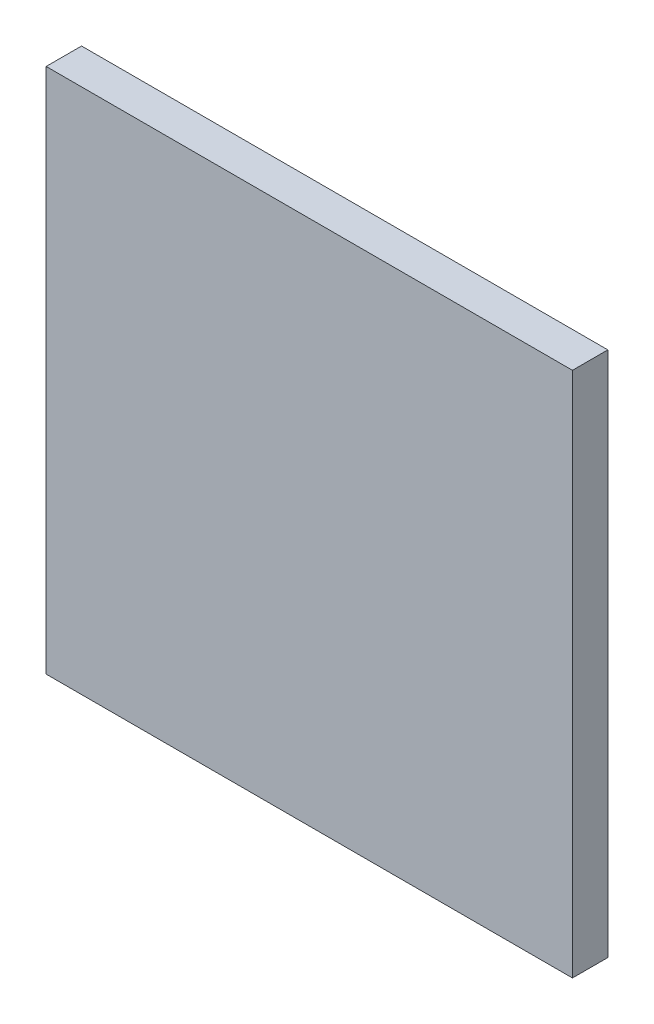
ISO-10303-21;
HEADER;
FILE_DESCRIPTION(('STEP AP214'),'2;1');
FILE_NAME('part.step','',(''),(''),'','','');
FILE_SCHEMA(('AUTOMOTIVE_DESIGN { 1 0 10303 214 1 1 1 1 }'));
ENDSEC;
DATA;
#1=APPLICATION_CONTEXT('core data for automotive mechanical design processes');
#2=APPLICATION_PROTOCOL_DEFINITION('international standard','automotive_design',2000,#1);
#3=PRODUCT_CONTEXT('',#1,'mechanical');
#4=PRODUCT('Part','Part','',(#3));
#5=PRODUCT_RELATED_PRODUCT_CATEGORY('part','',(#4));
#6=PRODUCT_DEFINITION_FORMATION('','',#4);
#7=PRODUCT_DEFINITION_CONTEXT('part definition',#1,'design');
#8=PRODUCT_DEFINITION('design','',#6,#7);
#9=PRODUCT_DEFINITION_SHAPE('','',#8);
#10=(LENGTH_UNIT() NAMED_UNIT(*) SI_UNIT(.MILLI.,.METRE.));
#11=(NAMED_UNIT(*) PLANE_ANGLE_UNIT() SI_UNIT($,.RADIAN.));
#12=(NAMED_UNIT(*) SI_UNIT($,.STERADIAN.) SOLID_ANGLE_UNIT());
#13=UNCERTAINTY_MEASURE_WITH_UNIT(LENGTH_MEASURE(1.E-05),#10,'distance_accuracy_value','');
#14=(GEOMETRIC_REPRESENTATION_CONTEXT(3) GLOBAL_UNCERTAINTY_ASSIGNED_CONTEXT((#13)) GLOBAL_UNIT_ASSIGNED_CONTEXT((#10,
#11,#12)) REPRESENTATION_CONTEXT('',''));
#15=CARTESIAN_POINT('',(0.,0.,0.));
#16=DIRECTION('',(0.,0.,1.));
#17=DIRECTION('',(1.,0.,0.));
#18=AXIS2_PLACEMENT_3D('',#15,#16,#17);
#19=CARTESIAN_POINT('',(0.,0.,0.6));
#20=DIRECTION('',(1.,0.,0.));
#21=DIRECTION('',(0.,1.,0.));
#22=AXIS2_PLACEMENT_3D('',#19,#20,#21);
#23=PLANE('',#22);
#24=DIRECTION('',(0.,-1.,0.));
#25=VECTOR('',#24,1.);
#26=CARTESIAN_POINT('',(0.,0.,0.));
#27=LINE('',#26,#25);
#28=CARTESIAN_POINT('',(0.,0.,0.));
#29=VERTEX_POINT('',#28);
#30=CARTESIAN_POINT('',(0.,-8.92,0.));
#31=VERTEX_POINT('',#30);
#32=EDGE_CURVE('E95',#29,#31,#27,.T.);
#33=ORIENTED_EDGE('',*,*,#32,.T.);
#34=DIRECTION('',(0.,0.,-1.));
#35=VECTOR('',#34,1.);
#36=CARTESIAN_POINT('',(0.,-8.92,0.6));
#37=LINE('',#36,#35);
#38=CARTESIAN_POINT('',(0.,-8.92,0.6));
#39=VERTEX_POINT('',#38);
#40=EDGE_CURVE('E11',#39,#31,#37,.T.);
#41=ORIENTED_EDGE('',*,*,#40,.F.);
#42=DIRECTION('',(0.,-1.,0.));
#43=VECTOR('',#42,1.);
#44=CARTESIAN_POINT('',(0.,0.,0.6));
#45=LINE('',#44,#43);
#46=CARTESIAN_POINT('',(0.,0.,0.6));
#47=VERTEX_POINT('',#46);
#48=EDGE_CURVE('E83',#47,#39,#45,.T.);
#49=ORIENTED_EDGE('',*,*,#48,.F.);
#50=DIRECTION('',(0.,0.,-1.));
#51=VECTOR('',#50,1.);
#52=CARTESIAN_POINT('',(0.,0.,0.6));
#53=LINE('',#52,#51);
#54=EDGE_CURVE('E91',#47,#29,#53,.T.);
#55=ORIENTED_EDGE('',*,*,#54,.T.);
#56=EDGE_LOOP('',(#33,#41,#49,#55));
#57=FACE_BOUND('',#56,.T.);
#58=ADVANCED_FACE('F32',(#57),#23,.F.);
#59=CARTESIAN_POINT('',(0.,-8.92,0.6));
#60=DIRECTION('',(0.,1.,0.));
#61=DIRECTION('',(0.,0.,1.));
#62=AXIS2_PLACEMENT_3D('',#59,#60,#61);
#63=PLANE('',#62);
#64=DIRECTION('',(1.,0.,0.));
#65=VECTOR('',#64,1.);
#66=CARTESIAN_POINT('',(0.,-8.92,0.));
#67=LINE('',#66,#65);
#68=CARTESIAN_POINT('',(8.92,-8.92,0.));
#69=VERTEX_POINT('',#68);
#70=EDGE_CURVE('E87',#31,#69,#67,.T.);
#71=ORIENTED_EDGE('',*,*,#70,.T.);
#72=DIRECTION('',(0.,0.,-1.));
#73=VECTOR('',#72,1.);
#74=CARTESIAN_POINT('',(8.92,-8.92,0.6));
#75=LINE('',#74,#73);
#76=CARTESIAN_POINT('',(8.92,-8.92,0.6));
#77=VERTEX_POINT('',#76);
#78=EDGE_CURVE('E40',#77,#69,#75,.T.);
#79=ORIENTED_EDGE('',*,*,#78,.F.);
#80=DIRECTION('',(1.,0.,0.));
#81=VECTOR('',#80,1.);
#82=CARTESIAN_POINT('',(0.,-8.92,0.6));
#83=LINE('',#82,#81);
#84=EDGE_CURVE('E78',#39,#77,#83,.T.);
#85=ORIENTED_EDGE('',*,*,#84,.F.);
#86=ORIENTED_EDGE('',*,*,#40,.T.);
#87=EDGE_LOOP('',(#71,#79,#85,#86));
#88=FACE_BOUND('',#87,.T.);
#89=ADVANCED_FACE('F86',(#88),#63,.F.);
#90=CARTESIAN_POINT('',(8.92,0.,0.6));
#91=DIRECTION('',(-1.,0.,0.));
#92=DIRECTION('',(0.,-1.,0.));
#93=AXIS2_PLACEMENT_3D('',#90,#91,#92);
#94=PLANE('',#93);
#95=DIRECTION('',(0.,1.,0.));
#96=VECTOR('',#95,1.);
#97=CARTESIAN_POINT('',(8.92,0.,0.));
#98=LINE('',#97,#96);
#99=CARTESIAN_POINT('',(8.92,0.,0.));
#100=VERTEX_POINT('',#99);
#101=EDGE_CURVE('E65',#69,#100,#98,.T.);
#102=ORIENTED_EDGE('',*,*,#101,.T.);
#103=DIRECTION('',(0.,0.,-1.));
#104=VECTOR('',#103,1.);
#105=CARTESIAN_POINT('',(8.92,0.,0.6));
#106=LINE('',#105,#104);
#107=CARTESIAN_POINT('',(8.92,0.,0.6));
#108=VERTEX_POINT('',#107);
#109=EDGE_CURVE('E88',#108,#100,#106,.T.);
#110=ORIENTED_EDGE('',*,*,#109,.F.);
#111=DIRECTION('',(0.,1.,0.));
#112=VECTOR('',#111,1.);
#113=CARTESIAN_POINT('',(8.92,0.,0.6));
#114=LINE('',#113,#112);
#115=EDGE_CURVE('E81',#77,#108,#114,.T.);
#116=ORIENTED_EDGE('',*,*,#115,.F.);
#117=ORIENTED_EDGE('',*,*,#78,.T.);
#118=EDGE_LOOP('',(#102,#110,#116,#117));
#119=FACE_BOUND('',#118,.T.);
#120=ADVANCED_FACE('F89',(#119),#94,.F.);
#121=CARTESIAN_POINT('',(0.,0.,0.6));
#122=DIRECTION('',(0.,-1.,0.));
#123=DIRECTION('',(0.,0.,-1.));
#124=AXIS2_PLACEMENT_3D('',#121,#122,#123);
#125=PLANE('',#124);
#126=DIRECTION('',(-1.,0.,0.));
#127=VECTOR('',#126,1.);
#128=CARTESIAN_POINT('',(0.,0.,0.));
#129=LINE('',#128,#127);
#130=EDGE_CURVE('E71',#100,#29,#129,.T.);
#131=ORIENTED_EDGE('',*,*,#130,.T.);
#132=ORIENTED_EDGE('',*,*,#54,.F.);
#133=DIRECTION('',(-1.,0.,0.));
#134=VECTOR('',#133,1.);
#135=CARTESIAN_POINT('',(0.,0.,0.6));
#136=LINE('',#135,#134);
#137=EDGE_CURVE('E48',#108,#47,#136,.T.);
#138=ORIENTED_EDGE('',*,*,#137,.F.);
#139=ORIENTED_EDGE('',*,*,#109,.T.);
#140=EDGE_LOOP('',(#131,#132,#138,#139));
#141=FACE_BOUND('',#140,.T.);
#142=ADVANCED_FACE('F102',(#141),#125,.F.);
#143=CARTESIAN_POINT('',(0.,0.,0.6));
#144=DIRECTION('',(0.,0.,1.));
#145=DIRECTION('',(1.,0.,0.));
#146=AXIS2_PLACEMENT_3D('',#143,#144,#145);
#147=PLANE('',#146);
#148=ORIENTED_EDGE('',*,*,#48,.T.);
#149=ORIENTED_EDGE('',*,*,#84,.T.);
#150=ORIENTED_EDGE('',*,*,#115,.T.);
#151=ORIENTED_EDGE('',*,*,#137,.T.);
#152=EDGE_LOOP('',(#148,#149,#150,#151));
#153=FACE_BOUND('',#152,.T.);
#154=ADVANCED_FACE('F79',(#153),#147,.T.);
#155=CARTESIAN_POINT('',(0.,0.,0.));
#156=DIRECTION('',(0.,0.,1.));
#157=DIRECTION('',(1.,0.,0.));
#158=AXIS2_PLACEMENT_3D('',#155,#156,#157);
#159=PLANE('',#158);
#160=ORIENTED_EDGE('',*,*,#32,.F.);
#161=ORIENTED_EDGE('',*,*,#130,.F.);
#162=ORIENTED_EDGE('',*,*,#101,.F.);
#163=ORIENTED_EDGE('',*,*,#70,.F.);
#164=EDGE_LOOP('',(#160,#161,#162,#163));
#165=FACE_BOUND('',#164,.T.);
#166=ADVANCED_FACE('F105',(#165),#159,.F.);
#167=CLOSED_SHELL('',(#58,#89,#120,#142,#154,#166));
#168=MANIFOLD_SOLID_BREP('B2',#167);
#169=ADVANCED_BREP_SHAPE_REPRESENTATION('',(#18,#168),#14);
#170=SHAPE_DEFINITION_REPRESENTATION(#9,#169);
ENDSEC;
END-ISO-10303-21;
